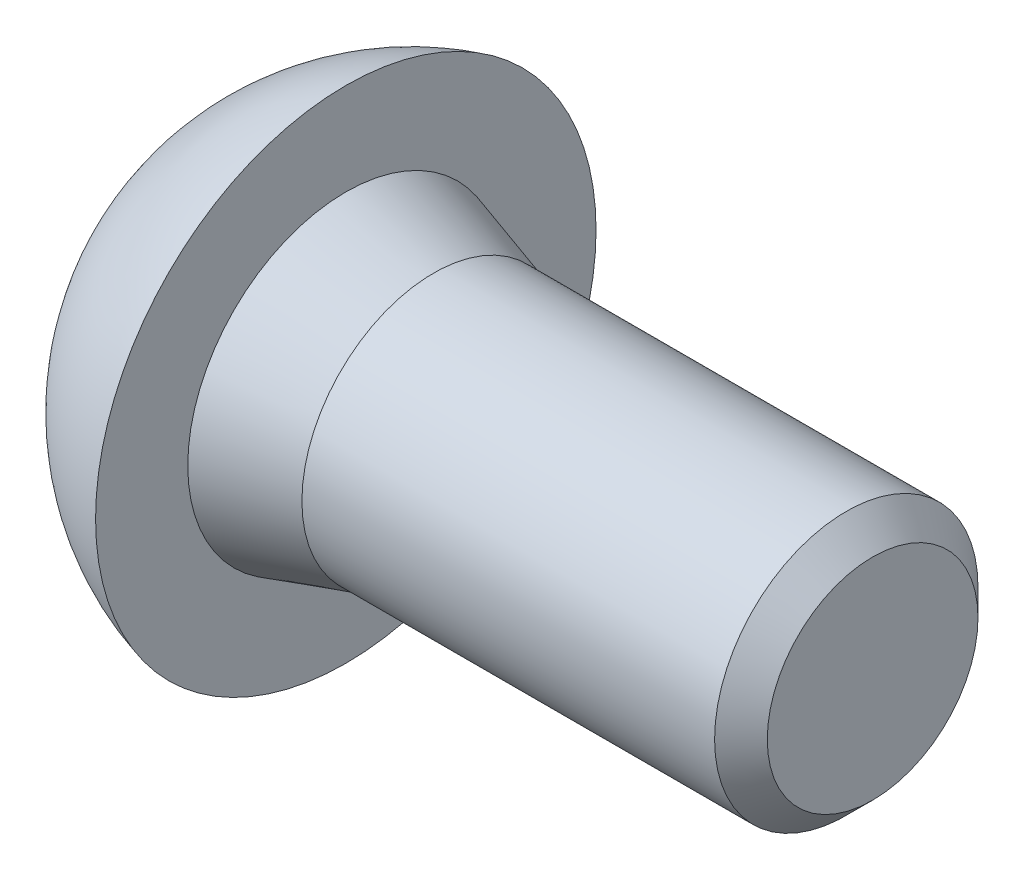
ISO-10303-21;
HEADER;
FILE_DESCRIPTION(('STEP AP214'),'2;1');
FILE_NAME('part.step','',(''),(''),'','','');
FILE_SCHEMA(('AUTOMOTIVE_DESIGN { 1 0 10303 214 1 1 1 1 }'));
ENDSEC;
DATA;
#1=APPLICATION_CONTEXT('core data for automotive mechanical design processes');
#2=APPLICATION_PROTOCOL_DEFINITION('international standard','automotive_design',2000,#1);
#3=PRODUCT_CONTEXT('',#1,'mechanical');
#4=PRODUCT('Part','Part','',(#3));
#5=PRODUCT_RELATED_PRODUCT_CATEGORY('part','',(#4));
#6=PRODUCT_DEFINITION_FORMATION('','',#4);
#7=PRODUCT_DEFINITION_CONTEXT('part definition',#1,'design');
#8=PRODUCT_DEFINITION('design','',#6,#7);
#9=PRODUCT_DEFINITION_SHAPE('','',#8);
#10=(LENGTH_UNIT() NAMED_UNIT(*) SI_UNIT(.MILLI.,.METRE.));
#11=(NAMED_UNIT(*) PLANE_ANGLE_UNIT() SI_UNIT($,.RADIAN.));
#12=(NAMED_UNIT(*) SI_UNIT($,.STERADIAN.) SOLID_ANGLE_UNIT());
#13=UNCERTAINTY_MEASURE_WITH_UNIT(LENGTH_MEASURE(1.E-05),#10,'distance_accuracy_value','');
#14=(GEOMETRIC_REPRESENTATION_CONTEXT(3) GLOBAL_UNCERTAINTY_ASSIGNED_CONTEXT((#13)) GLOBAL_UNIT_ASSIGNED_CONTEXT((#10,
#11,#12)) REPRESENTATION_CONTEXT('',''));
#15=CARTESIAN_POINT('',(0.,0.,0.));
#16=DIRECTION('',(0.,0.,1.));
#17=DIRECTION('',(1.,0.,0.));
#18=AXIS2_PLACEMENT_3D('',#15,#16,#17);
#19=CARTESIAN_POINT('',(0.,0.,0.));
#20=DIRECTION('',(1.,0.,0.));
#21=DIRECTION('',(0.,0.,-1.));
#22=AXIS2_PLACEMENT_3D('',#19,#20,#21);
#23=PLANE('',#22);
#24=CARTESIAN_POINT('',(0.,0.,0.));
#25=DIRECTION('',(1.,0.,0.));
#26=DIRECTION('',(0.,0.,-1.));
#27=AXIS2_PLACEMENT_3D('',#24,#25,#26);
#28=CIRCLE('',#27,1.2);
#29=CARTESIAN_POINT('',(0.,0.,-1.2));
#30=VERTEX_POINT('',#29);
#31=EDGE_CURVE('E64',#30,#30,#28,.T.);
#32=ORIENTED_EDGE('',*,*,#31,.T.);
#33=EDGE_LOOP('',(#32));
#34=FACE_BOUND('',#33,.T.);
#35=ADVANCED_FACE('F53',(#34),#23,.T.);
#36=CARTESIAN_POINT('',(0.,0.,0.));
#37=DIRECTION('',(1.,0.,0.));
#38=DIRECTION('',(0.,0.,-1.));
#39=AXIS2_PLACEMENT_3D('',#36,#37,#38);
#40=CYLINDRICAL_SURFACE('',#39,1.5);
#41=CARTESIAN_POINT('',(-0.299999999999967,0.,0.));
#42=DIRECTION('',(1.,0.,0.));
#43=DIRECTION('',(0.,0.,-1.));
#44=AXIS2_PLACEMENT_3D('',#41,#42,#43);
#45=CIRCLE('',#44,1.5);
#46=CARTESIAN_POINT('',(-0.299999999999967,0.,-1.5));
#47=VERTEX_POINT('',#46);
#48=EDGE_CURVE('E12',#47,#47,#45,.F.);
#49=ORIENTED_EDGE('',*,*,#48,.T.);
#50=EDGE_LOOP('',(#49));
#51=FACE_BOUND('',#50,.T.);
#52=CARTESIAN_POINT('',(-5.,0.,0.));
#53=DIRECTION('',(1.,0.,0.));
#54=DIRECTION('',(0.,0.,-1.));
#55=AXIS2_PLACEMENT_3D('',#52,#53,#54);
#56=CIRCLE('',#55,1.5);
#57=CARTESIAN_POINT('',(-5.,0.,-1.5));
#58=VERTEX_POINT('',#57);
#59=EDGE_CURVE('E180',#58,#58,#56,.T.);
#60=ORIENTED_EDGE('',*,*,#59,.T.);
#61=EDGE_LOOP('',(#60));
#62=FACE_BOUND('',#61,.T.);
#63=ADVANCED_FACE('F264',(#51,#62),#40,.T.);
#64=CARTESIAN_POINT('',(-5.,0.,0.));
#65=DIRECTION('',(-1.,0.,0.));
#66=DIRECTION('',(0.,0.,1.));
#67=AXIS2_PLACEMENT_3D('',#64,#65,#66);
#68=CONICAL_SURFACE('',#67,1.5,0.291456794477868);
#69=CARTESIAN_POINT('',(-6.00000000000001,0.,0.));
#70=DIRECTION('',(1.,0.,0.));
#71=DIRECTION('',(0.,0.,-1.));
#72=AXIS2_PLACEMENT_3D('',#69,#70,#71);
#73=CIRCLE('',#72,1.8);
#74=CARTESIAN_POINT('',(-6.00000000000001,0.,-1.8));
#75=VERTEX_POINT('',#74);
#76=EDGE_CURVE('E176',#75,#75,#73,.T.);
#77=ORIENTED_EDGE('',*,*,#76,.T.);
#78=EDGE_LOOP('',(#77));
#79=FACE_BOUND('',#78,.T.);
#80=ORIENTED_EDGE('',*,*,#59,.F.);
#81=EDGE_LOOP('',(#80));
#82=FACE_BOUND('',#81,.T.);
#83=ADVANCED_FACE('F269',(#79,#82),#68,.T.);
#84=CARTESIAN_POINT('',(-6.00000000000045,1.80000000000002,0.));
#85=DIRECTION('',(1.,0.,0.));
#86=DIRECTION('',(0.,0.,-1.));
#87=AXIS2_PLACEMENT_3D('',#84,#85,#86);
#88=PLANE('',#87);
#89=CARTESIAN_POINT('',(-6.00000000000001,0.,0.));
#90=DIRECTION('',(1.,0.,0.));
#91=DIRECTION('',(0.,0.,-1.));
#92=AXIS2_PLACEMENT_3D('',#89,#90,#91);
#93=CIRCLE('',#92,2.85);
#94=CARTESIAN_POINT('',(-6.00000000000001,2.85000000000002,0.));
#95=VERTEX_POINT('',#94);
#96=EDGE_CURVE('E172',#95,#95,#93,.T.);
#97=ORIENTED_EDGE('',*,*,#96,.T.);
#98=EDGE_LOOP('',(#97));
#99=FACE_BOUND('',#98,.T.);
#100=ORIENTED_EDGE('',*,*,#76,.F.);
#101=EDGE_LOOP('',(#100));
#102=FACE_BOUND('',#101,.T.);
#103=ADVANCED_FACE('F275',(#99,#102),#88,.T.);
#104=CARTESIAN_POINT('',(-5.24972727272732,0.,0.));
#105=DIRECTION('',(1.,0.,0.));
#106=DIRECTION('',(0.,1.,0.));
#107=AXIS2_PLACEMENT_3D('',#104,#105,#106);
#108=SPHERICAL_SURFACE('',#107,2.94710182472362);
#109=CARTESIAN_POINT('',(-7.65000000000005,0.,0.));
#110=DIRECTION('',(1.,0.,0.));
#111=DIRECTION('',(0.,0.,-1.));
#112=AXIS2_PLACEMENT_3D('',#109,#110,#111);
#113=CIRCLE('',#112,1.71);
#114=CARTESIAN_POINT('',(-7.65000000000005,1.71000000000002,0.));
#115=VERTEX_POINT('',#114);
#116=EDGE_CURVE('E132',#115,#115,#113,.T.);
#117=CARTESIAN_POINT('',(-7.65000000000005,1.71000000000002,0.));
#118=CARTESIAN_POINT('',(-7.63763155215909,1.72736126506089,0.));
#119=CARTESIAN_POINT('',(-7.62507468108565,1.74458829201828,0.));
#120=CARTESIAN_POINT('',(-7.59959014233806,1.77876586136067,0.));
#121=CARTESIAN_POINT('',(-7.58666247466393,1.79571640374568,0.));
#122=CARTESIAN_POINT('',(-7.56044239257924,1.8293329955779,0.));
#123=CARTESIAN_POINT('',(-7.54714997816869,1.84599904502512,0.));
#124=CARTESIAN_POINT('',(-7.52020667098918,1.87903881144571,0.));
#125=CARTESIAN_POINT('',(-7.50655577822023,1.8954125284191,0.));
#126=CARTESIAN_POINT('',(-7.47890193895047,1.92785991864908,0.));
#127=CARTESIAN_POINT('',(-7.46489899244967,1.94393359190569,0.));
#128=CARTESIAN_POINT('',(-7.4365476394595,1.97577332723367,0.));
#129=CARTESIAN_POINT('',(-7.42219923297013,1.99153938930505,0.));
#130=CARTESIAN_POINT('',(-7.39316371549975,2.02275647895624,0.));
#131=CARTESIAN_POINT('',(-7.37847660451873,2.03820750653606,0.));
#132=CARTESIAN_POINT('',(-7.34877059327599,2.06878725240587,0.));
#133=CARTESIAN_POINT('',(-7.33375169301425,2.08391597069587,0.));
#134=CARTESIAN_POINT('',(-7.30338917457334,2.1138439748931,0.));
#135=CARTESIAN_POINT('',(-7.28804555639417,2.12864326080033,0.));
#136=CARTESIAN_POINT('',(-7.25704082638653,2.15790543225927,0.));
#137=CARTESIAN_POINT('',(-7.24137971455806,2.17236831781097,0.));
#138=CARTESIAN_POINT('',(-7.20974737100145,2.20095087897062,0.));
#139=CARTESIAN_POINT('',(-7.19377613927331,2.21507055457856,0.));
#140=CARTESIAN_POINT('',(-7.16153107568258,2.24296004785759,0.));
#141=CARTESIAN_POINT('',(-7.14525724381998,2.25672986552867,0.));
#142=CARTESIAN_POINT('',(-7.11241464219899,2.28391315966487,0.));
#143=CARTESIAN_POINT('',(-7.09584587244059,2.29732663612999,0.));
#144=CARTESIAN_POINT('',(-7.06242119613291,2.32379093236205,0.));
#145=CARTESIAN_POINT('',(-7.04556528958363,2.33684175212898,0.));
#146=CARTESIAN_POINT('',(-7.01157427599222,2.36257459022273,0.));
#147=CARTESIAN_POINT('',(-6.9944391689501,2.37525660854956,0.));
#148=CARTESIAN_POINT('',(-6.95989782212754,2.40024587266467,0.));
#149=CARTESIAN_POINT('',(-6.94249158234711,2.41255311845295,0.));
#150=CARTESIAN_POINT('',(-6.90741616546042,2.43678704284739,0.));
#151=CARTESIAN_POINT('',(-6.88974698835416,2.44871372145355,0.));
#152=CARTESIAN_POINT('',(-6.85415401602755,2.47218089602332,0.));
#153=CARTESIAN_POINT('',(-6.8362302208072,2.48372139198693,0.));
#154=CARTESIAN_POINT('',(-6.80013645134649,2.50641076763827,0.));
#155=CARTESIAN_POINT('',(-6.78196647710612,2.517559647326,0.));
#156=CARTESIAN_POINT('',(-6.74538890460838,2.5394605411777,0.));
#157=CARTESIAN_POINT('',(-6.726981306351,2.55021255534166,0.));
#158=CARTESIAN_POINT('',(-6.68993715270318,2.57131465575482,0.));
#159=CARTESIAN_POINT('',(-6.67130059731274,2.58166474200402,0.));
#160=CARTESIAN_POINT('',(-6.63380730408309,2.60195811343725,0.));
#161=CARTESIAN_POINT('',(-6.61495056624389,2.61190139862129,0.));
#162=CARTESIAN_POINT('',(-6.57702578646981,2.63137648630829,0.));
#163=CARTESIAN_POINT('',(-6.55795774453495,2.64090828881126,0.));
#164=CARTESIAN_POINT('',(-6.51961933441178,2.65955592326088,0.));
#165=CARTESIAN_POINT('',(-6.50034896622348,2.66867175520754,0.));
#166=CARTESIAN_POINT('',(-6.46161497669573,2.68648315651592,0.));
#167=CARTESIAN_POINT('',(-6.44215135535628,2.69517872587765,0.));
#168=CARTESIAN_POINT('',(-6.40304002362422,2.71214550788134,0.));
#169=CARTESIAN_POINT('',(-6.3833923132316,2.72041672052331,0.));
#170=CARTESIAN_POINT('',(-6.34392205414396,2.73653089467584,0.));
#171=CARTESIAN_POINT('',(-6.32409950544894,2.7443738561864,0.));
#172=CARTESIAN_POINT('',(-6.28428890290957,2.75962783558792,0.));
#173=CARTESIAN_POINT('',(-6.26430084906523,2.76703885347887,0.));
#174=CARTESIAN_POINT('',(-6.22416864699612,2.78142545544664,0.));
#175=CARTESIAN_POINT('',(-6.20402449877136,2.78840103952346,0.));
#176=CARTESIAN_POINT('',(-6.16358959335877,2.80191349271195,0.));
#177=CARTESIAN_POINT('',(-6.14329883617093,2.80845036182362,0.));
#178=CARTESIAN_POINT('',(-6.10258026297008,2.8210822954614,0.));
#179=CARTESIAN_POINT('',(-6.08215244695707,2.82717735998751,0.));
#180=CARTESIAN_POINT('',(-6.04116938685165,2.83892285894356,0.));
#181=CARTESIAN_POINT('',(-6.02061414275924,2.84457329337349,0.));
#182=CARTESIAN_POINT('',(-6.00000000000001,2.85000000000002,0.));
#183=B_SPLINE_CURVE_WITH_KNOTS('',3,(#117,#118,#119,#120,#121,#122,#123,#124,#125,#126,#127,
#128,#129,#130,#131,#132,#133,#134,#135,#136,#137,#138,#139,#140,#141,#142,#143,#144,#145,#146,
#147,#148,#149,#150,#151,#152,#153,#154,#155,#156,#157,#158,#159,#160,#161,#162,#163,#164,#165,
#166,#167,#168,#169,#170,#171,#172,#173,#174,#175,#176,#177,#178,#179,#180,#181,#182),
.UNSPECIFIED.,.F.,.F.,(4,2,2,2,2,2,2,2,2,2,2,2,2,2,2,2,2,2,2,2,2,2,2,2,2,2,2,2,2,2,2,2,4),(0.,
0.0639481623083638,0.127896324616727,0.191844486925091,0.255792649233454,0.319740811541818,
0.383688973850181,0.447637136158545,0.511585298466909,0.575533460775272,0.639481623083636,
0.703429785392,0.767377947700363,0.831326110008726,0.89527427231709,0.959222434625454,
1.02317059693382,1.08711875924218,1.15106692155054,1.21501508385891,1.27896324616727,
1.34291140847563,1.406859570784,1.47080773309236,1.53475589540073,1.59870405770909,
1.66265222001745,1.72660038232582,1.79054854463418,1.85449670694254,1.91844486925091,
1.98239303155927,2.04634119386763),.UNSPECIFIED.);
#184=EDGE_CURVE('BSEAM279',#115,#95,#183,.T.);
#185=ORIENTED_EDGE('',*,*,#116,.T.);
#186=ORIENTED_EDGE('',*,*,#96,.F.);
#187=ORIENTED_EDGE('',*,*,#184,.T.);
#188=ORIENTED_EDGE('',*,*,#184,.F.);
#189=EDGE_LOOP('',(#185,#187,#186,#188));
#190=FACE_BOUND('',#189,.T.);
#191=ADVANCED_FACE('F279',(#190),#108,.T.);
#192=CARTESIAN_POINT('',(-7.65000000000038,1.7100000000001,0.));
#193=DIRECTION('',(-1.,0.,0.));
#194=DIRECTION('',(0.,0.,1.));
#195=AXIS2_PLACEMENT_3D('',#192,#193,#194);
#196=PLANE('',#195);
#197=DIRECTION('',(0.,0.5,-0.866025403784439));
#198=VECTOR('',#197,1.);
#199=CARTESIAN_POINT('',(-7.65000000000005,0.577350269189703,1.00000000000033));
#200=LINE('',#199,#198);
#201=CARTESIAN_POINT('',(-7.65000000000005,0.577350269189703,1.00000000000033));
#202=VERTEX_POINT('',#201);
#203=CARTESIAN_POINT('',(-7.65000000000049,1.15470053837963,0.));
#204=VERTEX_POINT('',#203);
#205=EDGE_CURVE('E73',#202,#204,#200,.T.);
#206=ORIENTED_EDGE('',*,*,#205,.F.);
#207=DIRECTION('',(0.,1.,0.));
#208=VECTOR('',#207,1.);
#209=CARTESIAN_POINT('',(-7.64999999999982,-0.577350269189925,0.99999999999989));
#210=LINE('',#209,#208);
#211=CARTESIAN_POINT('',(-7.64999999999982,-0.577350269189925,0.99999999999989));
#212=VERTEX_POINT('',#211);
#213=EDGE_CURVE('E135',#212,#202,#210,.T.);
#214=ORIENTED_EDGE('',*,*,#213,.F.);
#215=DIRECTION('',(0.,0.5,0.866025403784439));
#216=VECTOR('',#215,1.);
#217=CARTESIAN_POINT('',(-7.64999999999982,-1.15470053837941,0.));
#218=LINE('',#217,#216);
#219=CARTESIAN_POINT('',(-7.64999999999982,-1.15470053837941,0.));
#220=VERTEX_POINT('',#219);
#221=EDGE_CURVE('E140',#220,#212,#218,.T.);
#222=ORIENTED_EDGE('',*,*,#221,.F.);
#223=DIRECTION('',(0.,-0.5,0.866025403784439));
#224=VECTOR('',#223,1.);
#225=CARTESIAN_POINT('',(-7.65000000000005,-0.577350269189703,-0.99999999999989));
#226=LINE('',#225,#224);
#227=CARTESIAN_POINT('',(-7.65000000000005,-0.577350269189703,-0.99999999999989));
#228=VERTEX_POINT('',#227);
#229=EDGE_CURVE('E163',#228,#220,#226,.T.);
#230=ORIENTED_EDGE('',*,*,#229,.F.);
#231=DIRECTION('',(0.,-1.,0.));
#232=VECTOR('',#231,1.);
#233=CARTESIAN_POINT('',(-7.65000000000049,0.577350269189481,-0.99999999999989));
#234=LINE('',#233,#232);
#235=CARTESIAN_POINT('',(-7.65000000000049,0.577350269189481,-0.99999999999989));
#236=VERTEX_POINT('',#235);
#237=EDGE_CURVE('E154',#236,#228,#234,.T.);
#238=ORIENTED_EDGE('',*,*,#237,.F.);
#239=DIRECTION('',(0.,-0.500000000000001,-0.866025403784438));
#240=VECTOR('',#239,1.);
#241=CARTESIAN_POINT('',(-7.65000000000049,1.15470053837963,0.));
#242=LINE('',#241,#240);
#243=EDGE_CURVE('E147',#204,#236,#242,.T.);
#244=ORIENTED_EDGE('',*,*,#243,.F.);
#245=EDGE_LOOP('',(#206,#214,#222,#230,#238,#244));
#246=FACE_BOUND('',#245,.T.);
#247=ORIENTED_EDGE('',*,*,#116,.F.);
#248=EDGE_LOOP('',(#247));
#249=FACE_BOUND('',#248,.T.);
#250=ADVANCED_FACE('F143',(#246,#249),#196,.T.);
#251=CARTESIAN_POINT('',(-6.61,0.577350269189703,1.00000000000033));
#252=DIRECTION('',(0.,0.866025403784439,0.5));
#253=DIRECTION('',(0.,-0.5,0.866025403784439));
#254=AXIS2_PLACEMENT_3D('',#251,#252,#253);
#255=PLANE('',#254);
#256=ORIENTED_EDGE('',*,*,#205,.T.);
#257=DIRECTION('',(-1.,0.,0.));
#258=VECTOR('',#257,1.);
#259=CARTESIAN_POINT('',(-6.61000000000045,1.15470053837963,0.));
#260=LINE('',#259,#258);
#261=CARTESIAN_POINT('',(-6.61000000000045,1.15470053837963,0.));
#262=VERTEX_POINT('',#261);
#263=EDGE_CURVE('E190',#262,#204,#260,.T.);
#264=ORIENTED_EDGE('',*,*,#263,.F.);
#265=DIRECTION('',(0.,-0.5,0.866025403784439));
#266=VECTOR('',#265,1.);
#267=CARTESIAN_POINT('',(-6.61000000000045,1.15470053837963,0.));
#268=LINE('',#267,#266);
#269=CARTESIAN_POINT('',(-6.61,0.577350269189703,1.00000000000033));
#270=VERTEX_POINT('',#269);
#271=EDGE_CURVE('E57',#270,#262,#268,.F.);
#272=ORIENTED_EDGE('',*,*,#271,.F.);
#273=DIRECTION('',(-1.,0.,0.));
#274=VECTOR('',#273,1.);
#275=CARTESIAN_POINT('',(-6.61,0.577350269189703,1.00000000000033));
#276=LINE('',#275,#274);
#277=EDGE_CURVE('E129',#270,#202,#276,.T.);
#278=ORIENTED_EDGE('',*,*,#277,.T.);
#279=EDGE_LOOP('',(#256,#264,#272,#278));
#280=FACE_BOUND('',#279,.T.);
#281=ADVANCED_FACE('F130',(#280),#255,.F.);
#282=CARTESIAN_POINT('',(-6.60999999999978,-0.577350269189925,0.99999999999989));
#283=DIRECTION('',(0.,0.,1.));
#284=DIRECTION('',(0.,-1.,0.));
#285=AXIS2_PLACEMENT_3D('',#282,#283,#284);
#286=PLANE('',#285);
#287=ORIENTED_EDGE('',*,*,#213,.T.);
#288=ORIENTED_EDGE('',*,*,#277,.F.);
#289=DIRECTION('',(0.,1.,0.));
#290=VECTOR('',#289,1.);
#291=CARTESIAN_POINT('',(-6.61,2.22044604925031E-13,1.00000000000033));
#292=LINE('',#291,#290);
#293=CARTESIAN_POINT('',(-6.60999999999978,-0.577350269189925,0.99999999999989));
#294=VERTEX_POINT('',#293);
#295=EDGE_CURVE('E97',#294,#270,#292,.T.);
#296=ORIENTED_EDGE('',*,*,#295,.F.);
#297=DIRECTION('',(-1.,0.,0.));
#298=VECTOR('',#297,1.);
#299=CARTESIAN_POINT('',(-6.60999999999978,-0.577350269189925,0.99999999999989));
#300=LINE('',#299,#298);
#301=EDGE_CURVE('E125',#294,#212,#300,.T.);
#302=ORIENTED_EDGE('',*,*,#301,.T.);
#303=EDGE_LOOP('',(#287,#288,#296,#302));
#304=FACE_BOUND('',#303,.T.);
#305=ADVANCED_FACE('F136',(#304),#286,.F.);
#306=CARTESIAN_POINT('',(-6.60999999999978,-1.15470053837941,0.));
#307=DIRECTION('',(0.,-0.86602540378444,0.5));
#308=DIRECTION('',(0.,-0.5,-0.866025403784439));
#309=AXIS2_PLACEMENT_3D('',#306,#307,#308);
#310=PLANE('',#309);
#311=ORIENTED_EDGE('',*,*,#221,.T.);
#312=ORIENTED_EDGE('',*,*,#301,.F.);
#313=DIRECTION('',(0.,-0.500000000000001,-0.866025403784438));
#314=VECTOR('',#313,1.);
#315=CARTESIAN_POINT('',(-6.60999999999978,-0.577350269189925,0.99999999999989));
#316=LINE('',#315,#314);
#317=CARTESIAN_POINT('',(-6.60999999999978,-1.15470053837941,0.));
#318=VERTEX_POINT('',#317);
#319=EDGE_CURVE('E203',#318,#294,#316,.F.);
#320=ORIENTED_EDGE('',*,*,#319,.F.);
#321=DIRECTION('',(-1.,0.,0.));
#322=VECTOR('',#321,1.);
#323=CARTESIAN_POINT('',(-6.60999999999978,-1.15470053837941,0.));
#324=LINE('',#323,#322);
#325=EDGE_CURVE('E188',#318,#220,#324,.T.);
#326=ORIENTED_EDGE('',*,*,#325,.T.);
#327=EDGE_LOOP('',(#311,#312,#320,#326));
#328=FACE_BOUND('',#327,.T.);
#329=ADVANCED_FACE('F254',(#328),#310,.F.);
#330=CARTESIAN_POINT('',(-6.61,-0.577350269189925,-0.999999999999668));
#331=DIRECTION('',(0.,-0.86602540378444,-0.5));
#332=DIRECTION('',(0.,0.5,-0.866025403784439));
#333=AXIS2_PLACEMENT_3D('',#330,#331,#332);
#334=PLANE('',#333);
#335=ORIENTED_EDGE('',*,*,#229,.T.);
#336=ORIENTED_EDGE('',*,*,#325,.F.);
#337=DIRECTION('',(0.,0.5,-0.866025403784439));
#338=VECTOR('',#337,1.);
#339=CARTESIAN_POINT('',(-6.60999999999978,-1.15470053837941,0.));
#340=LINE('',#339,#338);
#341=CARTESIAN_POINT('',(-6.61,-0.577350269189925,-0.999999999999668));
#342=VERTEX_POINT('',#341);
#343=EDGE_CURVE('E206',#342,#318,#340,.F.);
#344=ORIENTED_EDGE('',*,*,#343,.F.);
#345=DIRECTION('',(-1.,0.,0.));
#346=VECTOR('',#345,1.);
#347=CARTESIAN_POINT('',(-6.61,-0.577350269189925,-0.999999999999668));
#348=LINE('',#347,#346);
#349=EDGE_CURVE('E196',#342,#228,#348,.T.);
#350=ORIENTED_EDGE('',*,*,#349,.T.);
#351=EDGE_LOOP('',(#335,#336,#344,#350));
#352=FACE_BOUND('',#351,.T.);
#353=ADVANCED_FACE('F251',(#352),#334,.F.);
#354=CARTESIAN_POINT('',(-6.61000000000045,0.577350269189481,-0.99999999999989));
#355=DIRECTION('',(0.,0.,-1.));
#356=DIRECTION('',(-1.,0.,0.));
#357=AXIS2_PLACEMENT_3D('',#354,#355,#356);
#358=PLANE('',#357);
#359=ORIENTED_EDGE('',*,*,#237,.T.);
#360=ORIENTED_EDGE('',*,*,#349,.F.);
#361=DIRECTION('',(0.,1.,0.));
#362=VECTOR('',#361,1.);
#363=CARTESIAN_POINT('',(-6.61000000000045,4.44089209850063E-13,-0.99999999999989));
#364=LINE('',#363,#362);
#365=CARTESIAN_POINT('',(-6.61000000000045,0.577350269189481,-0.99999999999989));
#366=VERTEX_POINT('',#365);
#367=EDGE_CURVE('E209',#366,#342,#364,.F.);
#368=ORIENTED_EDGE('',*,*,#367,.F.);
#369=DIRECTION('',(-1.,0.,0.));
#370=VECTOR('',#369,1.);
#371=CARTESIAN_POINT('',(-6.61000000000045,0.577350269189481,-0.99999999999989));
#372=LINE('',#371,#370);
#373=EDGE_CURVE('E193',#366,#236,#372,.T.);
#374=ORIENTED_EDGE('',*,*,#373,.T.);
#375=EDGE_LOOP('',(#359,#360,#368,#374));
#376=FACE_BOUND('',#375,.T.);
#377=ADVANCED_FACE('F226',(#376),#358,.F.);
#378=CARTESIAN_POINT('',(-6.61000000000045,1.15470053837963,0.));
#379=DIRECTION('',(0.,0.866025403784439,-0.5));
#380=DIRECTION('',(0.,0.500000000000001,0.866025403784439));
#381=AXIS2_PLACEMENT_3D('',#378,#379,#380);
#382=PLANE('',#381);
#383=ORIENTED_EDGE('',*,*,#243,.T.);
#384=ORIENTED_EDGE('',*,*,#373,.F.);
#385=DIRECTION('',(0.,0.500000000000001,0.866025403784438));
#386=VECTOR('',#385,1.);
#387=CARTESIAN_POINT('',(-6.61000000000045,0.577350269189481,-0.99999999999989));
#388=LINE('',#387,#386);
#389=EDGE_CURVE('E212',#262,#366,#388,.F.);
#390=ORIENTED_EDGE('',*,*,#389,.F.);
#391=ORIENTED_EDGE('',*,*,#263,.T.);
#392=EDGE_LOOP('',(#383,#384,#390,#391));
#393=FACE_BOUND('',#392,.T.);
#394=ADVANCED_FACE('F222',(#393),#382,.F.);
#395=CARTESIAN_POINT('',(0.,0.,0.));
#396=DIRECTION('',(-1.,0.,0.));
#397=DIRECTION('',(0.,0.,1.));
#398=AXIS2_PLACEMENT_3D('',#395,#396,#397);
#399=CONICAL_SURFACE('',#398,1.2,0.785398163397448);
#400=ORIENTED_EDGE('',*,*,#48,.F.);
#401=EDGE_LOOP('',(#400));
#402=FACE_BOUND('',#401,.T.);
#403=ORIENTED_EDGE('',*,*,#31,.F.);
#404=EDGE_LOOP('',(#403));
#405=FACE_BOUND('',#404,.T.);
#406=ADVANCED_FACE('F55',(#402,#405),#399,.T.);
#407=CARTESIAN_POINT('',(-6.14245569335681,-1.09715155111356,-0.633440743377456));
#408=DIRECTION('',(-0.979385865114737,-0.174935689354957,-0.100999167339957));
#409=DIRECTION('',(0.175834818906266,-0.984419685124288,0.));
#410=AXIS2_PLACEMENT_3D('',#407,#408,#409);
#411=PLANE('',#410);
#412=DIRECTION('',(-0.175834818906266,0.984419685124288,0.));
#413=VECTOR('',#412,1.);
#414=CARTESIAN_POINT('',(-6.40375000000004,0.,0.));
#415=LINE('',#414,#413);
#416=CARTESIAN_POINT('',(-6.40375000000004,0.,0.));
#417=VERTEX_POINT('',#416);
#418=EDGE_CURVE('E107',#417,#262,#415,.T.);
#419=ORIENTED_EDGE('',*,*,#418,.F.);
#420=DIRECTION('',(-0.175834818906266,0.492209842562145,0.85253245530311));
#421=VECTOR('',#420,1.);
#422=CARTESIAN_POINT('',(-6.40375000000004,0.,0.));
#423=LINE('',#422,#421);
#424=EDGE_CURVE('E149',#417,#270,#423,.T.);
#425=ORIENTED_EDGE('',*,*,#424,.T.);
#426=ORIENTED_EDGE('',*,*,#271,.T.);
#427=EDGE_LOOP('',(#419,#425,#426));
#428=FACE_BOUND('',#427,.T.);
#429=ADVANCED_FACE('F220',(#428),#411,.T.);
#430=CARTESIAN_POINT('',(-6.14245569335725,0.,-1.26688148675491));
#431=DIRECTION('',(-0.979385865114737,0.,-0.201998334679914));
#432=DIRECTION('',(-0.201998334679914,0.,0.979385865114736));
#433=AXIS2_PLACEMENT_3D('',#430,#431,#432);
#434=PLANE('',#433);
#435=ORIENTED_EDGE('',*,*,#424,.F.);
#436=DIRECTION('',(-0.175834818906266,-0.492209842562144,0.852532455303111));
#437=VECTOR('',#436,1.);
#438=CARTESIAN_POINT('',(-6.40375000000004,0.,0.));
#439=LINE('',#438,#437);
#440=EDGE_CURVE('E239',#417,#294,#439,.T.);
#441=ORIENTED_EDGE('',*,*,#440,.T.);
#442=ORIENTED_EDGE('',*,*,#295,.T.);
#443=EDGE_LOOP('',(#435,#441,#442));
#444=FACE_BOUND('',#443,.T.);
#445=ADVANCED_FACE('F314',(#444),#434,.T.);
#446=CARTESIAN_POINT('',(-6.14245569335659,-1.09715155111401,0.633440743377456));
#447=DIRECTION('',(-0.979385865114737,-0.174935689354957,0.100999167339957));
#448=DIRECTION('',(0.175834818906266,-0.984419685124288,0.));
#449=AXIS2_PLACEMENT_3D('',#446,#447,#448);
#450=PLANE('',#449);
#451=DIRECTION('',(-0.175834818906266,0.492209842562143,-0.852532455303111));
#452=VECTOR('',#451,1.);
#453=CARTESIAN_POINT('',(-6.40375000000004,0.,0.));
#454=LINE('',#453,#452);
#455=EDGE_CURVE('E231',#417,#366,#454,.T.);
#456=ORIENTED_EDGE('',*,*,#455,.F.);
#457=ORIENTED_EDGE('',*,*,#418,.T.);
#458=ORIENTED_EDGE('',*,*,#389,.T.);
#459=EDGE_LOOP('',(#456,#457,#458));
#460=FACE_BOUND('',#459,.T.);
#461=ADVANCED_FACE('F322',(#460),#450,.T.);
#462=CARTESIAN_POINT('',(-6.14245569335681,4.44089209850063E-13,1.26688148675491));
#463=DIRECTION('',(-0.979385865114737,0.,0.201998334679914));
#464=DIRECTION('',(0.201998334679914,0.,0.979385865114737));
#465=AXIS2_PLACEMENT_3D('',#462,#463,#464);
#466=PLANE('',#465);
#467=DIRECTION('',(-0.175834818906266,-0.492209842562143,-0.852532455303112));
#468=VECTOR('',#467,1.);
#469=CARTESIAN_POINT('',(-6.40375000000004,0.,0.));
#470=LINE('',#469,#468);
#471=EDGE_CURVE('E230',#417,#342,#470,.T.);
#472=ORIENTED_EDGE('',*,*,#471,.F.);
#473=ORIENTED_EDGE('',*,*,#455,.T.);
#474=ORIENTED_EDGE('',*,*,#367,.T.);
#475=EDGE_LOOP('',(#472,#473,#474));
#476=FACE_BOUND('',#475,.T.);
#477=ADVANCED_FACE('F229',(#476),#466,.T.);
#478=CARTESIAN_POINT('',(-6.14245569335725,1.09715155111423,0.633440743377456));
#479=DIRECTION('',(-0.979385865114737,0.174935689354957,0.100999167339957));
#480=DIRECTION('',(-0.175834818906267,-0.984419685124288,0.));
#481=AXIS2_PLACEMENT_3D('',#478,#479,#480);
#482=PLANE('',#481);
#483=DIRECTION('',(-0.175834818906266,-0.984419685124288,0.));
#484=VECTOR('',#483,1.);
#485=CARTESIAN_POINT('',(-6.40375000000004,0.,0.));
#486=LINE('',#485,#484);
#487=EDGE_CURVE('E113',#417,#318,#486,.T.);
#488=ORIENTED_EDGE('',*,*,#487,.F.);
#489=ORIENTED_EDGE('',*,*,#471,.T.);
#490=ORIENTED_EDGE('',*,*,#343,.T.);
#491=EDGE_LOOP('',(#488,#489,#490));
#492=FACE_BOUND('',#491,.T.);
#493=ADVANCED_FACE('F249',(#492),#482,.T.);
#494=CARTESIAN_POINT('',(-6.14245569335725,1.09715155111423,-0.633440743377456));
#495=DIRECTION('',(-0.979385865114737,0.174935689354957,-0.100999167339957));
#496=DIRECTION('',(-0.175834818906266,-0.984419685124288,0.));
#497=AXIS2_PLACEMENT_3D('',#494,#495,#496);
#498=PLANE('',#497);
#499=ORIENTED_EDGE('',*,*,#440,.F.);
#500=ORIENTED_EDGE('',*,*,#487,.T.);
#501=ORIENTED_EDGE('',*,*,#319,.T.);
#502=EDGE_LOOP('',(#499,#500,#501));
#503=FACE_BOUND('',#502,.T.);
#504=ADVANCED_FACE('F246',(#503),#498,.T.);
#505=CLOSED_SHELL('',(#35,#63,#83,#103,#191,#250,#281,#305,#329,#353,#377,#394,#406,#429,#445,
#461,#477,#493,#504));
#506=MANIFOLD_SOLID_BREP('B2',#505);
#507=ADVANCED_BREP_SHAPE_REPRESENTATION('',(#18,#506),#14);
#508=SHAPE_DEFINITION_REPRESENTATION(#9,#507);
ENDSEC;
END-ISO-10303-21;
